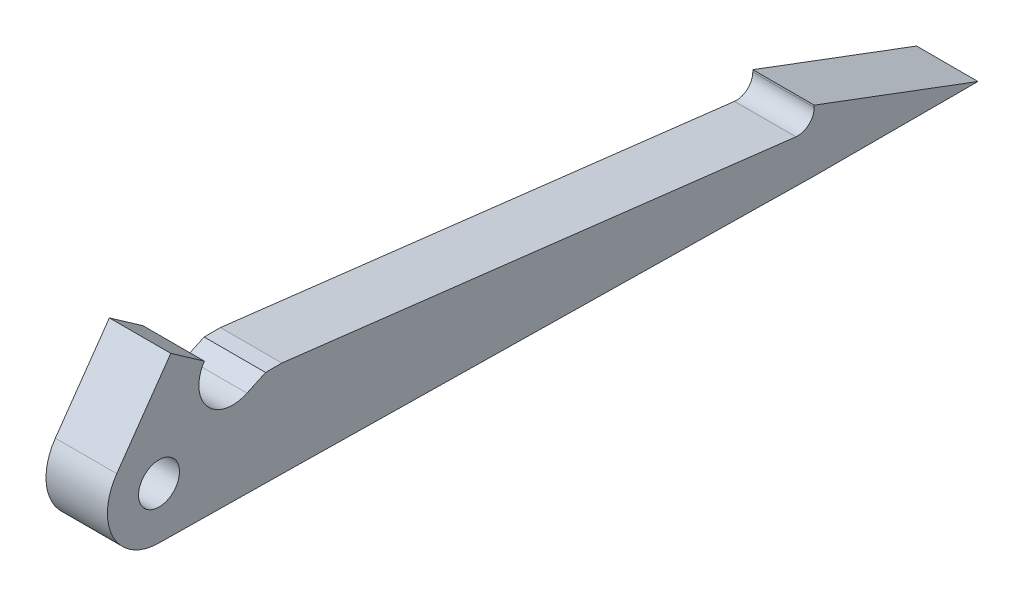
ISO-10303-21;
HEADER;
FILE_DESCRIPTION(('STEP AP214'),'2;1');
FILE_NAME('part.step','',(''),(''),'','','');
FILE_SCHEMA(('AUTOMOTIVE_DESIGN { 1 0 10303 214 1 1 1 1 }'));
ENDSEC;
DATA;
#1=APPLICATION_CONTEXT('core data for automotive mechanical design processes');
#2=APPLICATION_PROTOCOL_DEFINITION('international standard','automotive_design',2000,#1);
#3=PRODUCT_CONTEXT('',#1,'mechanical');
#4=PRODUCT('Part','Part','',(#3));
#5=PRODUCT_RELATED_PRODUCT_CATEGORY('part','',(#4));
#6=PRODUCT_DEFINITION_FORMATION('','',#4);
#7=PRODUCT_DEFINITION_CONTEXT('part definition',#1,'design');
#8=PRODUCT_DEFINITION('design','',#6,#7);
#9=PRODUCT_DEFINITION_SHAPE('','',#8);
#10=(LENGTH_UNIT() NAMED_UNIT(*) SI_UNIT(.MILLI.,.METRE.));
#11=(NAMED_UNIT(*) PLANE_ANGLE_UNIT() SI_UNIT($,.RADIAN.));
#12=(NAMED_UNIT(*) SI_UNIT($,.STERADIAN.) SOLID_ANGLE_UNIT());
#13=UNCERTAINTY_MEASURE_WITH_UNIT(LENGTH_MEASURE(1.E-05),#10,'distance_accuracy_value','');
#14=(GEOMETRIC_REPRESENTATION_CONTEXT(3) GLOBAL_UNCERTAINTY_ASSIGNED_CONTEXT((#13)) GLOBAL_UNIT_ASSIGNED_CONTEXT((#10,
#11,#12)) REPRESENTATION_CONTEXT('',''));
#15=CARTESIAN_POINT('',(0.,0.,0.));
#16=DIRECTION('',(0.,0.,1.));
#17=DIRECTION('',(1.,0.,0.));
#18=AXIS2_PLACEMENT_3D('',#15,#16,#17);
#19=CARTESIAN_POINT('',(4.7625,9.525,-176.47164647412));
#20=DIRECTION('',(1.,0.,0.));
#21=DIRECTION('',(0.,0.,-1.));
#22=AXIS2_PLACEMENT_3D('',#19,#20,#21);
#23=PLANE('',#22);
#24=CARTESIAN_POINT('',(4.7625,9.525,-176.47164647412));
#25=DIRECTION('',(1.,0.,0.));
#26=DIRECTION('',(0.,0.,-1.));
#27=AXIS2_PLACEMENT_3D('',#24,#25,#26);
#28=CIRCLE('',#27,8.00100000000001);
#29=CARTESIAN_POINT('',(4.7625,14.1141850672447,-169.917610967764));
#30=VERTEX_POINT('',#29);
#31=CARTESIAN_POINT('',(4.7625,1.52470715135464,-176.365272906379));
#32=VERTEX_POINT('',#31);
#33=EDGE_CURVE('E180',#30,#32,#28,.T.);
#34=ORIENTED_EDGE('',*,*,#33,.T.);
#35=DIRECTION('',(0.,-0.0132950340883751,-0.999911617128528));
#36=VECTOR('',#35,1.);
#37=CARTESIAN_POINT('',(4.7625,1.27000000001228,-195.521646474134));
#38=LINE('',#37,#36);
#39=CARTESIAN_POINT('',(4.7625,1.27000000001228,-195.521646474134));
#40=VERTEX_POINT('',#39);
#41=EDGE_CURVE('E157',#32,#40,#38,.T.);
#42=ORIENTED_EDGE('',*,*,#41,.T.);
#43=DIRECTION('',(0.,-0.0153827950432065,-0.999881677808259));
#44=VECTOR('',#43,1.);
#45=CARTESIAN_POINT('',(4.7625,1.27000000001228,-195.521646474134));
#46=LINE('',#45,#44);
#47=CARTESIAN_POINT('',(4.7625,1.22755538373154E-11,-278.07164647412));
#48=VERTEX_POINT('',#47);
#49=EDGE_CURVE('E139',#40,#48,#46,.T.);
#50=ORIENTED_EDGE('',*,*,#49,.T.);
#51=DIRECTION('',(0.,0.,-1.));
#52=VECTOR('',#51,1.);
#53=CARTESIAN_POINT('',(4.7625,1.22755538373154E-11,-278.07164647412));
#54=LINE('',#53,#52);
#55=CARTESIAN_POINT('',(4.7625,1.22755538373154E-11,-303.47164647412));
#56=VERTEX_POINT('',#55);
#57=EDGE_CURVE('E148',#48,#56,#54,.T.);
#58=ORIENTED_EDGE('',*,*,#57,.T.);
#59=DIRECTION('',(0.,0.351123441588392,0.936329177569044));
#60=VECTOR('',#59,1.);
#61=CARTESIAN_POINT('',(4.7625,9.52500000001227,-278.07164647412));
#62=LINE('',#61,#60);
#63=CARTESIAN_POINT('',(4.7625,9.52500000001227,-278.07164647412));
#64=VERTEX_POINT('',#63);
#65=EDGE_CURVE('E153',#56,#64,#62,.T.);
#66=ORIENTED_EDGE('',*,*,#65,.T.);
#67=DIRECTION('',(0.,-1.,0.));
#68=VECTOR('',#67,1.);
#69=CARTESIAN_POINT('',(4.7625,6.35000000001228,-278.07164647412));
#70=LINE('',#69,#68);
#71=CARTESIAN_POINT('',(4.7625,9.20989142492098,-278.07164647412));
#72=VERTEX_POINT('',#71);
#73=EDGE_CURVE('E165',#64,#72,#70,.T.);
#74=ORIENTED_EDGE('',*,*,#73,.T.);
#75=CARTESIAN_POINT('',(4.7625,9.20989142492098,-275.53164647412));
#76=DIRECTION('',(1.,0.,0.));
#77=DIRECTION('',(0.,0.,-1.));
#78=AXIS2_PLACEMENT_3D('',#75,#76,#77);
#79=CIRCLE('',#78,2.54);
#80=CARTESIAN_POINT('',(4.7625,6.68765692353487,-275.231757961474));
#81=VERTEX_POINT('',#80);
#82=EDGE_CURVE('E47',#72,#81,#79,.F.);
#83=ORIENTED_EDGE('',*,*,#82,.T.);
#84=DIRECTION('',(0.,0.118066343561759,0.993005709207131));
#85=VECTOR('',#84,1.);
#86=CARTESIAN_POINT('',(4.7625,16.1650258056597,-195.52164647412));
#87=LINE('',#86,#85);
#88=CARTESIAN_POINT('',(4.7625,16.1650258056597,-195.52164647412));
#89=VERTEX_POINT('',#88);
#90=EDGE_CURVE('E145',#81,#89,#87,.T.);
#91=ORIENTED_EDGE('',*,*,#90,.T.);
#92=DIRECTION('',(0.,4.24034515289397E-13,1.));
#93=VECTOR('',#92,1.);
#94=CARTESIAN_POINT('',(4.7625,16.1650258056608,-192.993410989747));
#95=LINE('',#94,#93);
#96=CARTESIAN_POINT('',(4.7625,16.1650258056608,-192.993410989747));
#97=VERTEX_POINT('',#96);
#98=EDGE_CURVE('E184',#89,#97,#95,.T.);
#99=ORIENTED_EDGE('',*,*,#98,.T.);
#100=DIRECTION('',(0.,-0.422618261740703,0.906307787036648));
#101=VECTOR('',#100,1.);
#102=CARTESIAN_POINT('',(4.7625,14.823212824634,-190.115883765906));
#103=LINE('',#102,#101);
#104=CARTESIAN_POINT('',(4.7625,14.8232128246335,-190.115883765906));
#105=VERTEX_POINT('',#104);
#106=EDGE_CURVE('E186',#97,#105,#103,.T.);
#107=ORIENTED_EDGE('',*,*,#106,.T.);
#108=CARTESIAN_POINT('',(4.7625,19.5790932010246,-187.898180325126));
#109=DIRECTION('',(-1.,0.,0.));
#110=DIRECTION('',(0.,0.,-1.));
#111=AXIS2_PLACEMENT_3D('',#108,#109,#110);
#112=CIRCLE('',#111,5.24753339253693);
#113=CARTESIAN_POINT('',(4.7625,22.4356903032563,-183.496310301906));
#114=VERTEX_POINT('',#113);
#115=EDGE_CURVE('E188',#105,#114,#112,.T.);
#116=ORIENTED_EDGE('',*,*,#115,.T.);
#117=DIRECTION('',(0.,0.573576436351047,0.819152044288991));
#118=VECTOR('',#117,1.);
#119=CARTESIAN_POINT('',(4.7625,26.0779006740854,-178.294694820671));
#120=LINE('',#119,#118);
#121=CARTESIAN_POINT('',(4.7625,26.0779006740854,-178.294694820671));
#122=VERTEX_POINT('',#121);
#123=EDGE_CURVE('E190',#114,#122,#120,.T.);
#124=ORIENTED_EDGE('',*,*,#123,.T.);
#125=DIRECTION('',(0.,-0.819152044288991,0.573576436351048));
#126=VECTOR('',#125,1.);
#127=CARTESIAN_POINT('',(4.7625,14.1141850672447,-169.917610967764));
#128=LINE('',#127,#126);
#129=EDGE_CURVE('E192',#122,#30,#128,.T.);
#130=ORIENTED_EDGE('',*,*,#129,.T.);
#131=EDGE_LOOP('',(#34,#42,#50,#58,#66,#74,#83,#91,#99,#107,#116,#124,#130));
#132=FACE_BOUND('',#131,.T.);
#133=CARTESIAN_POINT('',(4.7625,9.525,-176.47164647412));
#134=DIRECTION('',(1.,0.,0.));
#135=DIRECTION('',(0.,0.,-1.));
#136=AXIS2_PLACEMENT_3D('',#133,#134,#135);
#137=CIRCLE('',#136,3.17499999999995);
#138=CARTESIAN_POINT('',(4.7625,9.525,-173.296646474121));
#139=VERTEX_POINT('',#138);
#140=EDGE_CURVE('E174',#139,#139,#137,.T.);
#141=ORIENTED_EDGE('',*,*,#140,.F.);
#142=EDGE_LOOP('',(#141));
#143=FACE_BOUND('',#142,.T.);
#144=ADVANCED_FACE('F39',(#132,#143),#23,.T.);
#145=CARTESIAN_POINT('',(-4.7625,9.525,-176.47164647412));
#146=DIRECTION('',(1.,0.,0.));
#147=DIRECTION('',(0.,0.,-1.));
#148=AXIS2_PLACEMENT_3D('',#145,#146,#147);
#149=PLANE('',#148);
#150=CARTESIAN_POINT('',(-4.7625,9.525,-176.47164647412));
#151=DIRECTION('',(1.,0.,0.));
#152=DIRECTION('',(0.,0.,-1.));
#153=AXIS2_PLACEMENT_3D('',#150,#151,#152);
#154=CIRCLE('',#153,8.00100000000001);
#155=CARTESIAN_POINT('',(-4.7625,14.1141850672447,-169.917610967764));
#156=VERTEX_POINT('',#155);
#157=CARTESIAN_POINT('',(-4.7625,1.52470715135464,-176.365272906379));
#158=VERTEX_POINT('',#157);
#159=EDGE_CURVE('E177',#156,#158,#154,.T.);
#160=ORIENTED_EDGE('',*,*,#159,.F.);
#161=DIRECTION('',(0.,-0.819152044288991,0.573576436351048));
#162=VECTOR('',#161,1.);
#163=CARTESIAN_POINT('',(-4.7625,14.1141850672447,-169.917610967764));
#164=LINE('',#163,#162);
#165=CARTESIAN_POINT('',(-4.7625,26.0779006740854,-178.294694820671));
#166=VERTEX_POINT('',#165);
#167=EDGE_CURVE('E182',#166,#156,#164,.T.);
#168=ORIENTED_EDGE('',*,*,#167,.F.);
#169=DIRECTION('',(0.,0.573576436351047,0.819152044288991));
#170=VECTOR('',#169,1.);
#171=CARTESIAN_POINT('',(-4.7625,26.0779006740854,-178.294694820671));
#172=LINE('',#171,#170);
#173=CARTESIAN_POINT('',(-4.7625,22.4356903032563,-183.496310301906));
#174=VERTEX_POINT('',#173);
#175=EDGE_CURVE('E205',#174,#166,#172,.T.);
#176=ORIENTED_EDGE('',*,*,#175,.F.);
#177=CARTESIAN_POINT('',(-4.7625,19.5790932010246,-187.898180325126));
#178=DIRECTION('',(-1.,0.,0.));
#179=DIRECTION('',(0.,0.,-1.));
#180=AXIS2_PLACEMENT_3D('',#177,#178,#179);
#181=CIRCLE('',#180,5.24753339253693);
#182=CARTESIAN_POINT('',(-4.7625,14.8232128246335,-190.115883765906));
#183=VERTEX_POINT('',#182);
#184=EDGE_CURVE('E203',#183,#174,#181,.T.);
#185=ORIENTED_EDGE('',*,*,#184,.F.);
#186=DIRECTION('',(0.,-0.422618261740703,0.906307787036648));
#187=VECTOR('',#186,1.);
#188=CARTESIAN_POINT('',(-4.7625,14.823212824634,-190.115883765906));
#189=LINE('',#188,#187);
#190=CARTESIAN_POINT('',(-4.7625,16.1650258056608,-192.993410989747));
#191=VERTEX_POINT('',#190);
#192=EDGE_CURVE('E201',#191,#183,#189,.T.);
#193=ORIENTED_EDGE('',*,*,#192,.F.);
#194=DIRECTION('',(0.,4.24034515289397E-13,1.));
#195=VECTOR('',#194,1.);
#196=CARTESIAN_POINT('',(-4.7625,16.1650258056608,-192.993410989747));
#197=LINE('',#196,#195);
#198=CARTESIAN_POINT('',(-4.7625,16.1650258056597,-195.52164647412));
#199=VERTEX_POINT('',#198);
#200=EDGE_CURVE('E199',#199,#191,#197,.T.);
#201=ORIENTED_EDGE('',*,*,#200,.F.);
#202=DIRECTION('',(0.,-0.118066343561759,-0.993005709207131));
#203=VECTOR('',#202,1.);
#204=CARTESIAN_POINT('',(-4.7625,16.1650258056597,-195.52164647412));
#205=LINE('',#204,#203);
#206=CARTESIAN_POINT('',(-4.7625,6.68765692353487,-275.231757961474));
#207=VERTEX_POINT('',#206);
#208=EDGE_CURVE('E161',#199,#207,#205,.T.);
#209=ORIENTED_EDGE('',*,*,#208,.T.);
#210=CARTESIAN_POINT('',(-4.7625,9.20989142492098,-275.53164647412));
#211=DIRECTION('',(1.,0.,0.));
#212=DIRECTION('',(0.,0.,-1.));
#213=AXIS2_PLACEMENT_3D('',#210,#211,#212);
#214=CIRCLE('',#213,2.54);
#215=CARTESIAN_POINT('',(-4.7625,9.20989142492098,-278.07164647412));
#216=VERTEX_POINT('',#215);
#217=EDGE_CURVE('E11',#207,#216,#214,.T.);
#218=ORIENTED_EDGE('',*,*,#217,.T.);
#219=DIRECTION('',(0.,1.,0.));
#220=VECTOR('',#219,1.);
#221=CARTESIAN_POINT('',(-4.7625,6.35000000001228,-278.07164647412));
#222=LINE('',#221,#220);
#223=CARTESIAN_POINT('',(-4.7625,9.52500000001226,-278.07164647412));
#224=VERTEX_POINT('',#223);
#225=EDGE_CURVE('E238',#216,#224,#222,.T.);
#226=ORIENTED_EDGE('',*,*,#225,.T.);
#227=DIRECTION('',(0.,-0.351123441588392,-0.936329177569045));
#228=VECTOR('',#227,1.);
#229=CARTESIAN_POINT('',(-4.7625,9.52500000001227,-278.07164647412));
#230=LINE('',#229,#228);
#231=CARTESIAN_POINT('',(-4.7625,1.22755538373154E-11,-303.47164647412));
#232=VERTEX_POINT('',#231);
#233=EDGE_CURVE('E244',#224,#232,#230,.T.);
#234=ORIENTED_EDGE('',*,*,#233,.T.);
#235=DIRECTION('',(0.,0.,1.));
#236=VECTOR('',#235,1.);
#237=CARTESIAN_POINT('',(-4.7625,1.22755538373154E-11,-278.07164647412));
#238=LINE('',#237,#236);
#239=CARTESIAN_POINT('',(-4.7625,1.22755538373154E-11,-278.07164647412));
#240=VERTEX_POINT('',#239);
#241=EDGE_CURVE('E170',#232,#240,#238,.T.);
#242=ORIENTED_EDGE('',*,*,#241,.T.);
#243=DIRECTION('',(0.,0.0153827950432065,0.999881677808259));
#244=VECTOR('',#243,1.);
#245=CARTESIAN_POINT('',(-4.7625,1.27000000001228,-195.521646474134));
#246=LINE('',#245,#244);
#247=CARTESIAN_POINT('',(-4.7625,1.27000000001228,-195.521646474134));
#248=VERTEX_POINT('',#247);
#249=EDGE_CURVE('E141',#240,#248,#246,.T.);
#250=ORIENTED_EDGE('',*,*,#249,.T.);
#251=DIRECTION('',(0.,-0.0132950340883751,-0.999911617128528));
#252=VECTOR('',#251,1.);
#253=CARTESIAN_POINT('',(-4.7625,1.27000000001228,-195.521646474134));
#254=LINE('',#253,#252);
#255=EDGE_CURVE('E197',#158,#248,#254,.T.);
#256=ORIENTED_EDGE('',*,*,#255,.F.);
#257=EDGE_LOOP('',(#160,#168,#176,#185,#193,#201,#209,#218,#226,#234,#242,#250,#256));
#258=FACE_BOUND('',#257,.T.);
#259=CARTESIAN_POINT('',(-4.7625,9.525,-176.47164647412));
#260=DIRECTION('',(1.,0.,0.));
#261=DIRECTION('',(0.,0.,-1.));
#262=AXIS2_PLACEMENT_3D('',#259,#260,#261);
#263=CIRCLE('',#262,3.17499999999995);
#264=CARTESIAN_POINT('',(-4.7625,9.525,-173.296646474121));
#265=VERTEX_POINT('',#264);
#266=EDGE_CURVE('E173',#265,#265,#263,.T.);
#267=ORIENTED_EDGE('',*,*,#266,.T.);
#268=EDGE_LOOP('',(#267));
#269=FACE_BOUND('',#268,.T.);
#270=ADVANCED_FACE('F249',(#258,#269),#149,.F.);
#271=CARTESIAN_POINT('',(4.7625,9.525,-176.47164647412));
#272=DIRECTION('',(-1.,0.,0.));
#273=DIRECTION('',(0.,0.,1.));
#274=AXIS2_PLACEMENT_3D('',#271,#272,#273);
#275=CYLINDRICAL_SURFACE('',#274,8.00100000000001);
#276=ORIENTED_EDGE('',*,*,#159,.T.);
#277=DIRECTION('',(-1.,0.,0.));
#278=VECTOR('',#277,1.);
#279=CARTESIAN_POINT('',(4.7625,1.52470715135464,-176.365272906379));
#280=LINE('',#279,#278);
#281=EDGE_CURVE('E226',#32,#158,#280,.T.);
#282=ORIENTED_EDGE('',*,*,#281,.F.);
#283=ORIENTED_EDGE('',*,*,#33,.F.);
#284=DIRECTION('',(-1.,0.,0.));
#285=VECTOR('',#284,1.);
#286=CARTESIAN_POINT('',(4.7625,14.1141850672447,-169.917610967764));
#287=LINE('',#286,#285);
#288=EDGE_CURVE('E194',#30,#156,#287,.T.);
#289=ORIENTED_EDGE('',*,*,#288,.T.);
#290=EDGE_LOOP('',(#276,#282,#283,#289));
#291=FACE_BOUND('',#290,.T.);
#292=ADVANCED_FACE('F256',(#291),#275,.T.);
#293=CARTESIAN_POINT('',(4.7625,1.27000000001228,-195.521646474134));
#294=DIRECTION('',(0.,0.999911617128528,-0.0132950340883751));
#295=DIRECTION('',(0.,0.0132950340883751,0.999911617128529));
#296=AXIS2_PLACEMENT_3D('',#293,#294,#295);
#297=PLANE('',#296);
#298=ORIENTED_EDGE('',*,*,#255,.T.);
#299=DIRECTION('',(-1.,0.,0.));
#300=VECTOR('',#299,1.);
#301=CARTESIAN_POINT('',(4.7625,1.27000000001228,-195.521646474134));
#302=LINE('',#301,#300);
#303=EDGE_CURVE('E224',#40,#248,#302,.T.);
#304=ORIENTED_EDGE('',*,*,#303,.F.);
#305=ORIENTED_EDGE('',*,*,#41,.F.);
#306=ORIENTED_EDGE('',*,*,#281,.T.);
#307=EDGE_LOOP('',(#298,#304,#305,#306));
#308=FACE_BOUND('',#307,.T.);
#309=ADVANCED_FACE('F252',(#308),#297,.F.);
#310=CARTESIAN_POINT('',(4.7625,16.1650258056608,-192.993410989747));
#311=DIRECTION('',(0.,-1.,4.24034515289397E-13));
#312=DIRECTION('',(0.,-4.24034515289397E-13,-1.));
#313=AXIS2_PLACEMENT_3D('',#310,#311,#312);
#314=PLANE('',#313);
#315=ORIENTED_EDGE('',*,*,#200,.T.);
#316=DIRECTION('',(-1.,0.,0.));
#317=VECTOR('',#316,1.);
#318=CARTESIAN_POINT('',(4.7625,16.1650258056608,-192.993410989747));
#319=LINE('',#318,#317);
#320=EDGE_CURVE('E219',#97,#191,#319,.T.);
#321=ORIENTED_EDGE('',*,*,#320,.F.);
#322=ORIENTED_EDGE('',*,*,#98,.F.);
#323=DIRECTION('',(-1.,0.,0.));
#324=VECTOR('',#323,1.);
#325=CARTESIAN_POINT('',(4.7625,16.1650258056597,-195.52164647412));
#326=LINE('',#325,#324);
#327=EDGE_CURVE('E222',#89,#199,#326,.T.);
#328=ORIENTED_EDGE('',*,*,#327,.T.);
#329=EDGE_LOOP('',(#315,#321,#322,#328));
#330=FACE_BOUND('',#329,.T.);
#331=ADVANCED_FACE('F281',(#330),#314,.F.);
#332=CARTESIAN_POINT('',(4.7625,14.823212824634,-190.115883765906));
#333=DIRECTION('',(0.,-0.906307787036648,-0.422618261740703));
#334=DIRECTION('',(0.,0.422618261740703,-0.906307787036648));
#335=AXIS2_PLACEMENT_3D('',#332,#333,#334);
#336=PLANE('',#335);
#337=ORIENTED_EDGE('',*,*,#192,.T.);
#338=DIRECTION('',(-1.,0.,0.));
#339=VECTOR('',#338,1.);
#340=CARTESIAN_POINT('',(4.7625,14.8232128246335,-190.115883765906));
#341=LINE('',#340,#339);
#342=EDGE_CURVE('E216',#105,#183,#341,.T.);
#343=ORIENTED_EDGE('',*,*,#342,.F.);
#344=ORIENTED_EDGE('',*,*,#106,.F.);
#345=ORIENTED_EDGE('',*,*,#320,.T.);
#346=EDGE_LOOP('',(#337,#343,#344,#345));
#347=FACE_BOUND('',#346,.T.);
#348=ADVANCED_FACE('F276',(#347),#336,.F.);
#349=CARTESIAN_POINT('',(4.7625,19.5790932010246,-187.898180325126));
#350=DIRECTION('',(-1.,0.,0.));
#351=DIRECTION('',(0.,0.,1.));
#352=AXIS2_PLACEMENT_3D('',#349,#350,#351);
#353=CYLINDRICAL_SURFACE('',#352,5.24753339253693);
#354=ORIENTED_EDGE('',*,*,#184,.T.);
#355=DIRECTION('',(-1.,0.,0.));
#356=VECTOR('',#355,1.);
#357=CARTESIAN_POINT('',(4.7625,22.4356903032563,-183.496310301906));
#358=LINE('',#357,#356);
#359=EDGE_CURVE('E213',#114,#174,#358,.T.);
#360=ORIENTED_EDGE('',*,*,#359,.F.);
#361=ORIENTED_EDGE('',*,*,#115,.F.);
#362=ORIENTED_EDGE('',*,*,#342,.T.);
#363=EDGE_LOOP('',(#354,#360,#361,#362));
#364=FACE_BOUND('',#363,.T.);
#365=ADVANCED_FACE('F271',(#364),#353,.F.);
#366=CARTESIAN_POINT('',(4.7625,26.0779006740854,-178.294694820671));
#367=DIRECTION('',(0.,-0.819152044288991,0.573576436351047));
#368=DIRECTION('',(0.,-0.573576436351047,-0.819152044288991));
#369=AXIS2_PLACEMENT_3D('',#366,#367,#368);
#370=PLANE('',#369);
#371=ORIENTED_EDGE('',*,*,#175,.T.);
#372=DIRECTION('',(-1.,0.,0.));
#373=VECTOR('',#372,1.);
#374=CARTESIAN_POINT('',(4.7625,26.0779006740854,-178.294694820671));
#375=LINE('',#374,#373);
#376=EDGE_CURVE('E210',#122,#166,#375,.T.);
#377=ORIENTED_EDGE('',*,*,#376,.F.);
#378=ORIENTED_EDGE('',*,*,#123,.F.);
#379=ORIENTED_EDGE('',*,*,#359,.T.);
#380=EDGE_LOOP('',(#371,#377,#378,#379));
#381=FACE_BOUND('',#380,.T.);
#382=ADVANCED_FACE('F267',(#381),#370,.F.);
#383=CARTESIAN_POINT('',(4.7625,14.1141850672447,-169.917610967764));
#384=DIRECTION('',(0.,-0.573576436351048,-0.81915204428899));
#385=DIRECTION('',(0.,0.819152044288991,-0.573576436351048));
#386=AXIS2_PLACEMENT_3D('',#383,#384,#385);
#387=PLANE('',#386);
#388=ORIENTED_EDGE('',*,*,#167,.T.);
#389=ORIENTED_EDGE('',*,*,#288,.F.);
#390=ORIENTED_EDGE('',*,*,#129,.F.);
#391=ORIENTED_EDGE('',*,*,#376,.T.);
#392=EDGE_LOOP('',(#388,#389,#390,#391));
#393=FACE_BOUND('',#392,.T.);
#394=ADVANCED_FACE('F262',(#393),#387,.F.);
#395=CARTESIAN_POINT('',(4.7625,9.525,-176.47164647412));
#396=DIRECTION('',(-1.,0.,0.));
#397=DIRECTION('',(0.,0.,1.));
#398=AXIS2_PLACEMENT_3D('',#395,#396,#397);
#399=CYLINDRICAL_SURFACE('',#398,3.17499999999995);
#400=CARTESIAN_POINT('',(4.7625,9.525,-173.296646474121));
#401=CARTESIAN_POINT('',(4.66328125,9.525,-173.296646474121));
#402=CARTESIAN_POINT('',(4.5640625,9.525,-173.296646474121));
#403=CARTESIAN_POINT('',(4.365625,9.525,-173.296646474121));
#404=CARTESIAN_POINT('',(4.26640625,9.525,-173.296646474121));
#405=CARTESIAN_POINT('',(4.06796875,9.525,-173.296646474121));
#406=CARTESIAN_POINT('',(3.96875,9.525,-173.296646474121));
#407=CARTESIAN_POINT('',(3.7703125,9.525,-173.296646474121));
#408=CARTESIAN_POINT('',(3.67109375,9.525,-173.296646474121));
#409=CARTESIAN_POINT('',(3.47265625,9.525,-173.296646474121));
#410=CARTESIAN_POINT('',(3.3734375,9.525,-173.296646474121));
#411=CARTESIAN_POINT('',(3.175,9.525,-173.296646474121));
#412=CARTESIAN_POINT('',(3.07578125,9.525,-173.296646474121));
#413=CARTESIAN_POINT('',(2.87734375,9.525,-173.296646474121));
#414=CARTESIAN_POINT('',(2.778125,9.525,-173.296646474121));
#415=CARTESIAN_POINT('',(2.5796875,9.525,-173.296646474121));
#416=CARTESIAN_POINT('',(2.48046875,9.525,-173.296646474121));
#417=CARTESIAN_POINT('',(2.28203125,9.525,-173.296646474121));
#418=CARTESIAN_POINT('',(2.1828125,9.525,-173.296646474121));
#419=CARTESIAN_POINT('',(1.984375,9.525,-173.296646474121));
#420=CARTESIAN_POINT('',(1.88515625,9.525,-173.296646474121));
#421=CARTESIAN_POINT('',(1.68671875,9.525,-173.296646474121));
#422=CARTESIAN_POINT('',(1.5875,9.525,-173.296646474121));
#423=CARTESIAN_POINT('',(1.3890625,9.525,-173.296646474121));
#424=CARTESIAN_POINT('',(1.28984375,9.525,-173.296646474121));
#425=CARTESIAN_POINT('',(1.09140625,9.525,-173.296646474121));
#426=CARTESIAN_POINT('',(0.992187499999999,9.525,-173.296646474121));
#427=CARTESIAN_POINT('',(0.79375,9.525,-173.296646474121));
#428=CARTESIAN_POINT('',(0.69453125,9.525,-173.296646474121));
#429=CARTESIAN_POINT('',(0.49609375,9.525,-173.296646474121));
#430=CARTESIAN_POINT('',(0.396875,9.525,-173.296646474121));
#431=CARTESIAN_POINT('',(0.1984375,9.525,-173.296646474121));
#432=CARTESIAN_POINT('',(0.0992187500000001,9.525,-173.296646474121));
#433=CARTESIAN_POINT('',(-0.0992187500000001,9.525,-173.296646474121));
#434=CARTESIAN_POINT('',(-0.1984375,9.525,-173.296646474121));
#435=CARTESIAN_POINT('',(-0.396875,9.525,-173.296646474121));
#436=CARTESIAN_POINT('',(-0.49609375,9.525,-173.296646474121));
#437=CARTESIAN_POINT('',(-0.69453125,9.525,-173.296646474121));
#438=CARTESIAN_POINT('',(-0.793750000000001,9.525,-173.296646474121));
#439=CARTESIAN_POINT('',(-0.992187500000001,9.525,-173.296646474121));
#440=CARTESIAN_POINT('',(-1.09140625,9.525,-173.296646474121));
#441=CARTESIAN_POINT('',(-1.28984375,9.525,-173.296646474121));
#442=CARTESIAN_POINT('',(-1.3890625,9.525,-173.296646474121));
#443=CARTESIAN_POINT('',(-1.5875,9.525,-173.296646474121));
#444=CARTESIAN_POINT('',(-1.68671875,9.525,-173.296646474121));
#445=CARTESIAN_POINT('',(-1.88515625,9.525,-173.296646474121));
#446=CARTESIAN_POINT('',(-1.984375,9.525,-173.296646474121));
#447=CARTESIAN_POINT('',(-2.1828125,9.525,-173.296646474121));
#448=CARTESIAN_POINT('',(-2.28203125,9.525,-173.296646474121));
#449=CARTESIAN_POINT('',(-2.48046875,9.525,-173.296646474121));
#450=CARTESIAN_POINT('',(-2.5796875,9.525,-173.296646474121));
#451=CARTESIAN_POINT('',(-2.778125,9.525,-173.296646474121));
#452=CARTESIAN_POINT('',(-2.87734375,9.525,-173.296646474121));
#453=CARTESIAN_POINT('',(-3.07578125,9.525,-173.296646474121));
#454=CARTESIAN_POINT('',(-3.175,9.525,-173.296646474121));
#455=CARTESIAN_POINT('',(-3.3734375,9.525,-173.296646474121));
#456=CARTESIAN_POINT('',(-3.47265625,9.525,-173.296646474121));
#457=CARTESIAN_POINT('',(-3.67109375,9.525,-173.296646474121));
#458=CARTESIAN_POINT('',(-3.7703125,9.525,-173.296646474121));
#459=CARTESIAN_POINT('',(-3.96875,9.525,-173.296646474121));
#460=CARTESIAN_POINT('',(-4.06796875,9.525,-173.296646474121));
#461=CARTESIAN_POINT('',(-4.26640625,9.525,-173.296646474121));
#462=CARTESIAN_POINT('',(-4.365625,9.525,-173.296646474121));
#463=CARTESIAN_POINT('',(-4.5640625,9.525,-173.296646474121));
#464=CARTESIAN_POINT('',(-4.66328125,9.525,-173.296646474121));
#465=CARTESIAN_POINT('',(-4.7625,9.525,-173.296646474121));
#466=B_SPLINE_CURVE_WITH_KNOTS('',3,(#400,#401,#402,#403,#404,#405,#406,#407,#408,#409,#410,
#411,#412,#413,#414,#415,#416,#417,#418,#419,#420,#421,#422,#423,#424,#425,#426,#427,#428,#429,
#430,#431,#432,#433,#434,#435,#436,#437,#438,#439,#440,#441,#442,#443,#444,#445,#446,#447,#448,
#449,#450,#451,#452,#453,#454,#455,#456,#457,#458,#459,#460,#461,#462,#463,#464,#465),
.UNSPECIFIED.,.F.,.F.,(4,2,2,2,2,2,2,2,2,2,2,2,2,2,2,2,2,2,2,2,2,2,2,2,2,2,2,2,2,2,2,2,4),(0.,
0.29765625,0.5953125,0.892968750000001,1.190625,1.48828125,1.7859375,2.08359375,2.38125,
2.67890625,2.9765625,3.27421875,3.571875,3.86953125,4.1671875,4.46484375,4.7625,5.06015625,
5.3578125,5.65546875,5.953125,6.25078125,6.5484375,6.84609375,7.14375,7.44140625,7.7390625,
8.03671875,8.334375,8.63203125,8.9296875,9.22734375,9.525),.UNSPECIFIED.);
#467=EDGE_CURVE('BSEAM296',#139,#265,#466,.T.);
#468=ORIENTED_EDGE('',*,*,#140,.T.);
#469=ORIENTED_EDGE('',*,*,#266,.F.);
#470=ORIENTED_EDGE('',*,*,#467,.T.);
#471=ORIENTED_EDGE('',*,*,#467,.F.);
#472=EDGE_LOOP('',(#468,#470,#469,#471));
#473=FACE_BOUND('',#472,.T.);
#474=ADVANCED_FACE('F296',(#473),#399,.F.);
#475=CARTESIAN_POINT('',(-113.916109923343,16.1650258056597,-195.52164647412));
#476=DIRECTION('',(0.,0.993005709207131,-0.118066343561759));
#477=DIRECTION('',(0.,0.118066343561759,0.993005709207131));
#478=AXIS2_PLACEMENT_3D('',#475,#476,#477);
#479=PLANE('',#478);
#480=ORIENTED_EDGE('',*,*,#90,.F.);
#481=DIRECTION('',(1.,0.,0.));
#482=VECTOR('',#481,1.);
#483=CARTESIAN_POINT('',(-4.7625,6.68765692353487,-275.231757961474));
#484=LINE('',#483,#482);
#485=EDGE_CURVE('E60',#81,#207,#484,.F.);
#486=ORIENTED_EDGE('',*,*,#485,.T.);
#487=ORIENTED_EDGE('',*,*,#208,.F.);
#488=ORIENTED_EDGE('',*,*,#327,.F.);
#489=EDGE_LOOP('',(#480,#486,#487,#488));
#490=FACE_BOUND('',#489,.T.);
#491=ADVANCED_FACE('F283',(#490),#479,.T.);
#492=CARTESIAN_POINT('',(-113.916109923343,6.35000000001228,-278.07164647412));
#493=DIRECTION('',(0.,0.,1.));
#494=DIRECTION('',(1.,0.,0.));
#495=AXIS2_PLACEMENT_3D('',#492,#493,#494);
#496=PLANE('',#495);
#497=ORIENTED_EDGE('',*,*,#225,.F.);
#498=DIRECTION('',(1.,0.,0.));
#499=VECTOR('',#498,1.);
#500=CARTESIAN_POINT('',(4.7625,9.20989142492098,-278.07164647412));
#501=LINE('',#500,#499);
#502=EDGE_CURVE('E229',#216,#72,#501,.T.);
#503=ORIENTED_EDGE('',*,*,#502,.T.);
#504=ORIENTED_EDGE('',*,*,#73,.F.);
#505=DIRECTION('',(1.,0.,0.));
#506=VECTOR('',#505,1.);
#507=CARTESIAN_POINT('',(-113.916109923343,9.52500000001227,-278.07164647412));
#508=LINE('',#507,#506);
#509=EDGE_CURVE('E168',#224,#64,#508,.T.);
#510=ORIENTED_EDGE('',*,*,#509,.F.);
#511=EDGE_LOOP('',(#497,#503,#504,#510));
#512=FACE_BOUND('',#511,.T.);
#513=ADVANCED_FACE('F236',(#512),#496,.T.);
#514=CARTESIAN_POINT('',(-113.916109923343,9.52500000001227,-278.07164647412));
#515=DIRECTION('',(0.,0.936329177569044,-0.351123441588392));
#516=DIRECTION('',(0.,0.351123441588392,0.936329177569045));
#517=AXIS2_PLACEMENT_3D('',#514,#515,#516);
#518=PLANE('',#517);
#519=ORIENTED_EDGE('',*,*,#233,.F.);
#520=ORIENTED_EDGE('',*,*,#509,.T.);
#521=ORIENTED_EDGE('',*,*,#65,.F.);
#522=DIRECTION('',(1.,0.,0.));
#523=VECTOR('',#522,1.);
#524=CARTESIAN_POINT('',(-113.916109923343,1.22755538373154E-11,-303.47164647412));
#525=LINE('',#524,#523);
#526=EDGE_CURVE('E144',#232,#56,#525,.T.);
#527=ORIENTED_EDGE('',*,*,#526,.F.);
#528=EDGE_LOOP('',(#519,#520,#521,#527));
#529=FACE_BOUND('',#528,.T.);
#530=ADVANCED_FACE('F243',(#529),#518,.T.);
#531=CARTESIAN_POINT('',(-113.916109923343,1.22755538373154E-11,-278.07164647412));
#532=DIRECTION('',(0.,-1.,0.));
#533=DIRECTION('',(0.,0.,-1.));
#534=AXIS2_PLACEMENT_3D('',#531,#532,#533);
#535=PLANE('',#534);
#536=ORIENTED_EDGE('',*,*,#241,.F.);
#537=ORIENTED_EDGE('',*,*,#526,.T.);
#538=ORIENTED_EDGE('',*,*,#57,.F.);
#539=DIRECTION('',(1.,0.,0.));
#540=VECTOR('',#539,1.);
#541=CARTESIAN_POINT('',(-113.916109923343,1.22755538373154E-11,-278.07164647412));
#542=LINE('',#541,#540);
#543=EDGE_CURVE('E134',#240,#48,#542,.T.);
#544=ORIENTED_EDGE('',*,*,#543,.F.);
#545=EDGE_LOOP('',(#536,#537,#538,#544));
#546=FACE_BOUND('',#545,.T.);
#547=ADVANCED_FACE('F149',(#546),#535,.T.);
#548=CARTESIAN_POINT('',(-113.916109923343,1.27000000001228,-195.521646474134));
#549=DIRECTION('',(0.,-0.999881677808259,0.0153827950432065));
#550=DIRECTION('',(0.,-0.0153827950432065,-0.999881677808259));
#551=AXIS2_PLACEMENT_3D('',#548,#549,#550);
#552=PLANE('',#551);
#553=ORIENTED_EDGE('',*,*,#249,.F.);
#554=ORIENTED_EDGE('',*,*,#543,.T.);
#555=ORIENTED_EDGE('',*,*,#49,.F.);
#556=ORIENTED_EDGE('',*,*,#303,.T.);
#557=EDGE_LOOP('',(#553,#554,#555,#556));
#558=FACE_BOUND('',#557,.T.);
#559=ADVANCED_FACE('F136',(#558),#552,.T.);
#560=CARTESIAN_POINT('',(-113.916109923343,9.20989142492098,-275.53164647412));
#561=DIRECTION('',(-1.,0.,0.));
#562=DIRECTION('',(0.,0.,1.));
#563=AXIS2_PLACEMENT_3D('',#560,#561,#562);
#564=CYLINDRICAL_SURFACE('',#563,2.54);
#565=ORIENTED_EDGE('',*,*,#217,.F.);
#566=ORIENTED_EDGE('',*,*,#485,.F.);
#567=ORIENTED_EDGE('',*,*,#82,.F.);
#568=ORIENTED_EDGE('',*,*,#502,.F.);
#569=EDGE_LOOP('',(#565,#566,#567,#568));
#570=FACE_BOUND('',#569,.T.);
#571=ADVANCED_FACE('F41',(#570),#564,.F.);
#572=CLOSED_SHELL('',(#144,#270,#292,#309,#331,#348,#365,#382,#394,#474,#491,#513,#530,#547,
#559,#571));
#573=MANIFOLD_SOLID_BREP('B2',#572);
#574=ADVANCED_BREP_SHAPE_REPRESENTATION('',(#18,#573),#14);
#575=SHAPE_DEFINITION_REPRESENTATION(#9,#574);
ENDSEC;
END-ISO-10303-21;
